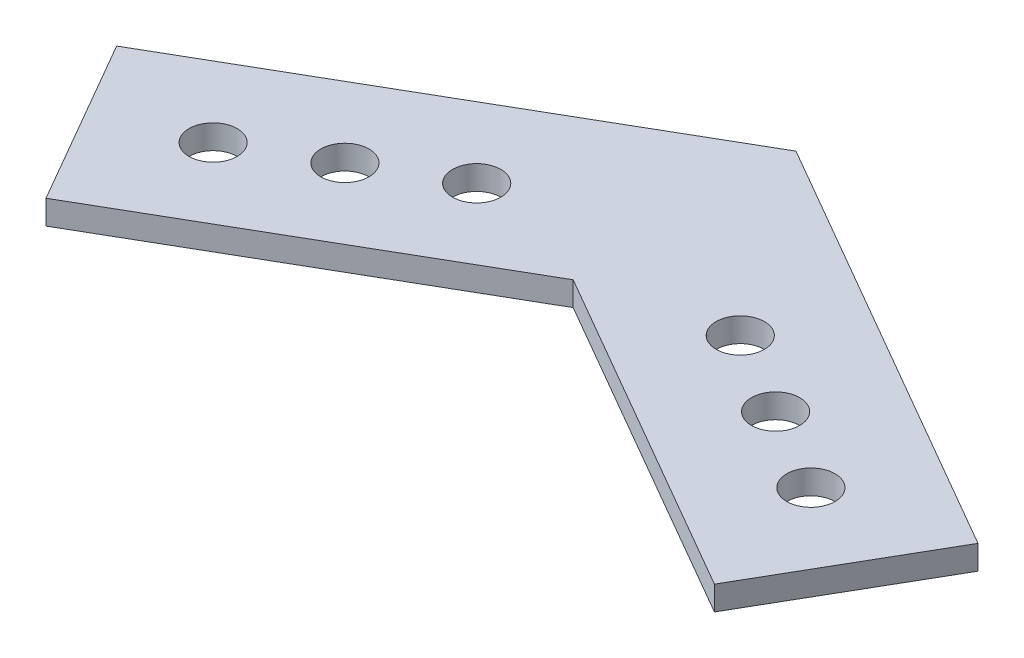
ISO-10303-21;
HEADER;
FILE_DESCRIPTION(('STEP AP214'),'2;1');
FILE_NAME('part.step','',(''),(''),'','','');
FILE_SCHEMA(('AUTOMOTIVE_DESIGN { 1 0 10303 214 1 1 1 1 }'));
ENDSEC;
DATA;
#1=APPLICATION_CONTEXT('core data for automotive mechanical design processes');
#2=APPLICATION_PROTOCOL_DEFINITION('international standard','automotive_design',2000,#1);
#3=PRODUCT_CONTEXT('',#1,'mechanical');
#4=PRODUCT('Part','Part','',(#3));
#5=PRODUCT_RELATED_PRODUCT_CATEGORY('part','',(#4));
#6=PRODUCT_DEFINITION_FORMATION('','',#4);
#7=PRODUCT_DEFINITION_CONTEXT('part definition',#1,'design');
#8=PRODUCT_DEFINITION('design','',#6,#7);
#9=PRODUCT_DEFINITION_SHAPE('','',#8);
#10=(LENGTH_UNIT() NAMED_UNIT(*) SI_UNIT(.MILLI.,.METRE.));
#11=(NAMED_UNIT(*) PLANE_ANGLE_UNIT() SI_UNIT($,.RADIAN.));
#12=(NAMED_UNIT(*) SI_UNIT($,.STERADIAN.) SOLID_ANGLE_UNIT());
#13=UNCERTAINTY_MEASURE_WITH_UNIT(LENGTH_MEASURE(1.E-05),#10,'distance_accuracy_value','');
#14=(GEOMETRIC_REPRESENTATION_CONTEXT(3) GLOBAL_UNCERTAINTY_ASSIGNED_CONTEXT((#13)) GLOBAL_UNIT_ASSIGNED_CONTEXT((#10,
#11,#12)) REPRESENTATION_CONTEXT('',''));
#15=CARTESIAN_POINT('',(0.,0.,0.));
#16=DIRECTION('',(0.,0.,1.));
#17=DIRECTION('',(1.,0.,0.));
#18=AXIS2_PLACEMENT_3D('',#15,#16,#17);
#19=CARTESIAN_POINT('',(-43.9940905122494,3.175,25.4000000000001));
#20=DIRECTION('',(-0.866025403784438,0.,0.500000000000001));
#21=DIRECTION('',(0.500000000000001,0.,0.866025403784438));
#22=AXIS2_PLACEMENT_3D('',#19,#20,#21);
#23=PLANE('',#22);
#24=DIRECTION('',(-0.500000000000001,0.,-0.866025403784438));
#25=VECTOR('',#24,1.);
#26=CARTESIAN_POINT('',(-43.9940905122494,0.,25.4000000000001));
#27=LINE('',#26,#25);
#28=CARTESIAN_POINT('',(-43.9940905122494,0.,25.4000000000001));
#29=VERTEX_POINT('',#28);
#30=CARTESIAN_POINT('',(-56.6940905122495,0.,3.40295474387533));
#31=VERTEX_POINT('',#30);
#32=EDGE_CURVE('E136',#29,#31,#27,.T.);
#33=ORIENTED_EDGE('',*,*,#32,.F.);
#34=DIRECTION('',(0.,-1.,0.));
#35=VECTOR('',#34,1.);
#36=CARTESIAN_POINT('',(-43.9940905122494,3.175,25.4000000000001));
#37=LINE('',#36,#35);
#38=CARTESIAN_POINT('',(-43.9940905122494,3.175,25.4000000000001));
#39=VERTEX_POINT('',#38);
#40=EDGE_CURVE('E53',#39,#29,#37,.T.);
#41=ORIENTED_EDGE('',*,*,#40,.F.);
#42=DIRECTION('',(-0.500000000000001,0.,-0.866025403784438));
#43=VECTOR('',#42,1.);
#44=CARTESIAN_POINT('',(-43.9940905122494,3.175,25.4000000000001));
#45=LINE('',#44,#43);
#46=CARTESIAN_POINT('',(-56.6940905122495,3.175,3.40295474387533));
#47=VERTEX_POINT('',#46);
#48=EDGE_CURVE('E130',#39,#47,#45,.T.);
#49=ORIENTED_EDGE('',*,*,#48,.T.);
#50=DIRECTION('',(0.,-1.,0.));
#51=VECTOR('',#50,1.);
#52=CARTESIAN_POINT('',(-56.6940905122495,3.175,3.40295474387533));
#53=LINE('',#52,#51);
#54=EDGE_CURVE('E11',#47,#31,#53,.T.);
#55=ORIENTED_EDGE('',*,*,#54,.T.);
#56=EDGE_LOOP('',(#33,#41,#49,#55));
#57=FACE_BOUND('',#56,.T.);
#58=ADVANCED_FACE('F44',(#57),#23,.T.);
#59=CARTESIAN_POINT('',(0.,3.175,0.));
#60=DIRECTION('',(0.500000000000001,0.,0.866025403784438));
#61=DIRECTION('',(0.866025403784438,0.,-0.500000000000001));
#62=AXIS2_PLACEMENT_3D('',#59,#60,#61);
#63=PLANE('',#62);
#64=DIRECTION('',(-0.866025403784438,0.,0.500000000000001));
#65=VECTOR('',#64,1.);
#66=CARTESIAN_POINT('',(0.,0.,0.));
#67=LINE('',#66,#65);
#68=CARTESIAN_POINT('',(0.,0.,0.));
#69=VERTEX_POINT('',#68);
#70=EDGE_CURVE('E140',#69,#29,#67,.T.);
#71=ORIENTED_EDGE('',*,*,#70,.F.);
#72=DIRECTION('',(0.,-1.,0.));
#73=VECTOR('',#72,1.);
#74=CARTESIAN_POINT('',(0.,3.175,0.));
#75=LINE('',#74,#73);
#76=CARTESIAN_POINT('',(0.,3.175,0.));
#77=VERTEX_POINT('',#76);
#78=EDGE_CURVE('E114',#77,#69,#75,.T.);
#79=ORIENTED_EDGE('',*,*,#78,.F.);
#80=DIRECTION('',(-0.866025403784438,0.,0.500000000000001));
#81=VECTOR('',#80,1.);
#82=CARTESIAN_POINT('',(0.,3.175,0.));
#83=LINE('',#82,#81);
#84=EDGE_CURVE('E126',#77,#39,#83,.T.);
#85=ORIENTED_EDGE('',*,*,#84,.T.);
#86=ORIENTED_EDGE('',*,*,#40,.T.);
#87=EDGE_LOOP('',(#71,#79,#85,#86));
#88=FACE_BOUND('',#87,.T.);
#89=ADVANCED_FACE('F164',(#88),#63,.T.);
#90=CARTESIAN_POINT('',(43.9940905122494,3.175,25.4));
#91=DIRECTION('',(-0.500000000000001,0.,0.866025403784438));
#92=DIRECTION('',(0.866025403784438,0.,0.500000000000001));
#93=AXIS2_PLACEMENT_3D('',#90,#91,#92);
#94=PLANE('',#93);
#95=DIRECTION('',(-0.866025403784438,0.,-0.500000000000001));
#96=VECTOR('',#95,1.);
#97=CARTESIAN_POINT('',(43.9940905122494,0.,25.4));
#98=LINE('',#97,#96);
#99=CARTESIAN_POINT('',(43.9940905122494,0.,25.4));
#100=VERTEX_POINT('',#99);
#101=EDGE_CURVE('E111',#100,#69,#98,.T.);
#102=ORIENTED_EDGE('',*,*,#101,.F.);
#103=DIRECTION('',(0.,-1.,0.));
#104=VECTOR('',#103,1.);
#105=CARTESIAN_POINT('',(43.9940905122494,3.175,25.4));
#106=LINE('',#105,#104);
#107=CARTESIAN_POINT('',(43.9940905122494,3.175,25.4));
#108=VERTEX_POINT('',#107);
#109=EDGE_CURVE('E105',#108,#100,#106,.T.);
#110=ORIENTED_EDGE('',*,*,#109,.F.);
#111=DIRECTION('',(-0.866025403784438,0.,-0.500000000000001));
#112=VECTOR('',#111,1.);
#113=CARTESIAN_POINT('',(43.9940905122494,3.175,25.4));
#114=LINE('',#113,#112);
#115=EDGE_CURVE('E109',#108,#77,#114,.T.);
#116=ORIENTED_EDGE('',*,*,#115,.T.);
#117=ORIENTED_EDGE('',*,*,#78,.T.);
#118=EDGE_LOOP('',(#102,#110,#116,#117));
#119=FACE_BOUND('',#118,.T.);
#120=ADVANCED_FACE('F107',(#119),#94,.T.);
#121=CARTESIAN_POINT('',(43.9940905122494,3.175,25.4));
#122=DIRECTION('',(-0.866025403784437,0.,-0.500000000000002));
#123=DIRECTION('',(-0.500000000000002,0.,0.866025403784437));
#124=AXIS2_PLACEMENT_3D('',#121,#122,#123);
#125=PLANE('',#124);
#126=DIRECTION('',(0.500000000000002,0.,-0.866025403784437));
#127=VECTOR('',#126,1.);
#128=CARTESIAN_POINT('',(43.9940905122494,0.,25.4));
#129=LINE('',#128,#127);
#130=CARTESIAN_POINT('',(56.6940905122495,0.,3.4029547438753));
#131=VERTEX_POINT('',#130);
#132=EDGE_CURVE('E147',#100,#131,#129,.T.);
#133=ORIENTED_EDGE('',*,*,#132,.T.);
#134=DIRECTION('',(0.,-1.,0.));
#135=VECTOR('',#134,1.);
#136=CARTESIAN_POINT('',(56.6940905122495,3.175,3.4029547438753));
#137=LINE('',#136,#135);
#138=CARTESIAN_POINT('',(56.6940905122495,3.175,3.4029547438753));
#139=VERTEX_POINT('',#138);
#140=EDGE_CURVE('E115',#139,#131,#137,.T.);
#141=ORIENTED_EDGE('',*,*,#140,.F.);
#142=DIRECTION('',(0.500000000000002,0.,-0.866025403784437));
#143=VECTOR('',#142,1.);
#144=CARTESIAN_POINT('',(43.9940905122494,3.175,25.4));
#145=LINE('',#144,#143);
#146=EDGE_CURVE('E118',#108,#139,#145,.T.);
#147=ORIENTED_EDGE('',*,*,#146,.F.);
#148=ORIENTED_EDGE('',*,*,#109,.T.);
#149=EDGE_LOOP('',(#133,#141,#147,#148));
#150=FACE_BOUND('',#149,.T.);
#151=ADVANCED_FACE('F119',(#150),#125,.F.);
#152=CARTESIAN_POINT('',(0.,3.175,-29.329393674833));
#153=DIRECTION('',(0.500000000000001,0.,-0.866025403784438));
#154=DIRECTION('',(-0.866025403784438,0.,-0.500000000000001));
#155=AXIS2_PLACEMENT_3D('',#152,#153,#154);
#156=PLANE('',#155);
#157=DIRECTION('',(0.866025403784438,0.,0.500000000000001));
#158=VECTOR('',#157,1.);
#159=CARTESIAN_POINT('',(0.,0.,-29.329393674833));
#160=LINE('',#159,#158);
#161=CARTESIAN_POINT('',(0.,0.,-29.329393674833));
#162=VERTEX_POINT('',#161);
#163=EDGE_CURVE('E84',#162,#131,#160,.T.);
#164=ORIENTED_EDGE('',*,*,#163,.F.);
#165=DIRECTION('',(0.,-1.,0.));
#166=VECTOR('',#165,1.);
#167=CARTESIAN_POINT('',(0.,3.175,-29.329393674833));
#168=LINE('',#167,#166);
#169=CARTESIAN_POINT('',(0.,3.175,-29.329393674833));
#170=VERTEX_POINT('',#169);
#171=EDGE_CURVE('E90',#170,#162,#168,.T.);
#172=ORIENTED_EDGE('',*,*,#171,.F.);
#173=DIRECTION('',(-0.866025403784438,0.,-0.500000000000001));
#174=VECTOR('',#173,1.);
#175=CARTESIAN_POINT('',(56.6940905122495,3.175,3.4029547438753));
#176=LINE('',#175,#174);
#177=EDGE_CURVE('E61',#139,#170,#176,.T.);
#178=ORIENTED_EDGE('',*,*,#177,.F.);
#179=ORIENTED_EDGE('',*,*,#140,.T.);
#180=EDGE_LOOP('',(#164,#172,#178,#179));
#181=FACE_BOUND('',#180,.T.);
#182=ADVANCED_FACE('F169',(#181),#156,.T.);
#183=CARTESIAN_POINT('',(-25.3999999999999,3.175,-14.6646968374165));
#184=DIRECTION('',(-0.500000000000002,0.,-0.866025403784438));
#185=DIRECTION('',(-0.866025403784438,0.,0.500000000000002));
#186=AXIS2_PLACEMENT_3D('',#183,#184,#185);
#187=PLANE('',#186);
#188=DIRECTION('',(0.866025403784438,0.,-0.500000000000002));
#189=VECTOR('',#188,1.);
#190=CARTESIAN_POINT('',(-25.3999999999999,0.,-14.6646968374165));
#191=LINE('',#190,#189);
#192=EDGE_CURVE('E152',#31,#162,#191,.T.);
#193=ORIENTED_EDGE('',*,*,#192,.F.);
#194=ORIENTED_EDGE('',*,*,#54,.F.);
#195=DIRECTION('',(-0.866025403784438,0.,0.500000000000001));
#196=VECTOR('',#195,1.);
#197=CARTESIAN_POINT('',(-25.3999999999999,3.175,-14.6646968374165));
#198=LINE('',#197,#196);
#199=EDGE_CURVE('E94',#170,#47,#198,.T.);
#200=ORIENTED_EDGE('',*,*,#199,.F.);
#201=ORIENTED_EDGE('',*,*,#171,.T.);
#202=EDGE_LOOP('',(#193,#194,#200,#201));
#203=FACE_BOUND('',#202,.T.);
#204=ADVANCED_FACE('F170',(#203),#187,.T.);
#205=CARTESIAN_POINT('',(0.,3.175,0.));
#206=DIRECTION('',(0.,-1.,0.));
#207=DIRECTION('',(0.,0.,-1.));
#208=AXIS2_PLACEMENT_3D('',#205,#206,#207);
#209=PLANE('',#208);
#210=CARTESIAN_POINT('',(28.3470452561247,3.175,1.70147737193762));
#211=DIRECTION('',(0.,1.,0.));
#212=DIRECTION('',(0.,0.,1.));
#213=AXIS2_PLACEMENT_3D('',#210,#211,#212);
#214=CIRCLE('',#213,3.175);
#215=CARTESIAN_POINT('',(28.3470452561247,3.175,4.87647737193762));
#216=VERTEX_POINT('',#215);
#217=EDGE_CURVE('E215',#216,#216,#214,.T.);
#218=ORIENTED_EDGE('',*,*,#217,.F.);
#219=EDGE_LOOP('',(#218));
#220=FACE_BOUND('',#219,.T.);
#221=CARTESIAN_POINT('',(17.3485226280624,3.175,-4.64852262806239));
#222=DIRECTION('',(0.,1.,0.));
#223=DIRECTION('',(0.,0.,1.));
#224=AXIS2_PLACEMENT_3D('',#221,#222,#223);
#225=CIRCLE('',#224,3.175);
#226=CARTESIAN_POINT('',(17.3485226280624,3.175,-1.47352262806239));
#227=VERTEX_POINT('',#226);
#228=EDGE_CURVE('E207',#227,#227,#225,.T.);
#229=ORIENTED_EDGE('',*,*,#228,.F.);
#230=EDGE_LOOP('',(#229));
#231=FACE_BOUND('',#230,.T.);
#232=CARTESIAN_POINT('',(39.3455678841871,3.175,8.05147737193763));
#233=DIRECTION('',(0.,1.,0.));
#234=DIRECTION('',(0.,0.,1.));
#235=AXIS2_PLACEMENT_3D('',#232,#233,#234);
#236=CIRCLE('',#235,3.175);
#237=CARTESIAN_POINT('',(39.3455678841871,3.175,11.2264773719376));
#238=VERTEX_POINT('',#237);
#239=EDGE_CURVE('E199',#238,#238,#236,.T.);
#240=ORIENTED_EDGE('',*,*,#239,.F.);
#241=EDGE_LOOP('',(#240));
#242=FACE_BOUND('',#241,.T.);
#243=CARTESIAN_POINT('',(-28.3470452561247,3.175,1.70147737193766));
#244=DIRECTION('',(0.,1.,0.));
#245=DIRECTION('',(0.,0.,1.));
#246=AXIS2_PLACEMENT_3D('',#243,#244,#245);
#247=CIRCLE('',#246,3.175);
#248=CARTESIAN_POINT('',(-28.3470452561247,3.175,4.87647737193766));
#249=VERTEX_POINT('',#248);
#250=EDGE_CURVE('E192',#249,#249,#247,.T.);
#251=ORIENTED_EDGE('',*,*,#250,.F.);
#252=EDGE_LOOP('',(#251));
#253=FACE_BOUND('',#252,.T.);
#254=CARTESIAN_POINT('',(-17.3485226280624,3.175,-4.64852262806235));
#255=DIRECTION('',(0.,1.,0.));
#256=DIRECTION('',(0.,0.,1.));
#257=AXIS2_PLACEMENT_3D('',#254,#255,#256);
#258=CIRCLE('',#257,3.175);
#259=CARTESIAN_POINT('',(-17.3485226280624,3.175,-1.47352262806235));
#260=VERTEX_POINT('',#259);
#261=EDGE_CURVE('E183',#260,#260,#258,.T.);
#262=ORIENTED_EDGE('',*,*,#261,.F.);
#263=EDGE_LOOP('',(#262));
#264=FACE_BOUND('',#263,.T.);
#265=CARTESIAN_POINT('',(-39.3455678841871,3.175,8.05147737193768));
#266=DIRECTION('',(0.,1.,0.));
#267=DIRECTION('',(0.,0.,1.));
#268=AXIS2_PLACEMENT_3D('',#265,#266,#267);
#269=CIRCLE('',#268,3.175);
#270=CARTESIAN_POINT('',(-39.3455678841871,3.175,11.2264773719377));
#271=VERTEX_POINT('',#270);
#272=EDGE_CURVE('E175',#271,#271,#269,.T.);
#273=ORIENTED_EDGE('',*,*,#272,.F.);
#274=EDGE_LOOP('',(#273));
#275=FACE_BOUND('',#274,.T.);
#276=ORIENTED_EDGE('',*,*,#199,.T.);
#277=ORIENTED_EDGE('',*,*,#48,.F.);
#278=ORIENTED_EDGE('',*,*,#84,.F.);
#279=ORIENTED_EDGE('',*,*,#115,.F.);
#280=ORIENTED_EDGE('',*,*,#146,.T.);
#281=ORIENTED_EDGE('',*,*,#177,.T.);
#282=EDGE_LOOP('',(#276,#277,#278,#279,#280,#281));
#283=FACE_BOUND('',#282,.T.);
#284=ADVANCED_FACE('F124',(#220,#231,#242,#253,#264,#275,#283),#209,.F.);
#285=CARTESIAN_POINT('',(0.,0.,0.));
#286=DIRECTION('',(0.,-1.,0.));
#287=DIRECTION('',(0.,0.,-1.));
#288=AXIS2_PLACEMENT_3D('',#285,#286,#287);
#289=PLANE('',#288);
#290=CARTESIAN_POINT('',(28.3470452561247,0.,1.70147737193762));
#291=DIRECTION('',(0.,1.,0.));
#292=DIRECTION('',(0.,0.,1.));
#293=AXIS2_PLACEMENT_3D('',#290,#291,#292);
#294=CIRCLE('',#293,3.175);
#295=CARTESIAN_POINT('',(28.3470452561247,0.,4.87647737193762));
#296=VERTEX_POINT('',#295);
#297=EDGE_CURVE('E203',#296,#296,#294,.T.);
#298=ORIENTED_EDGE('',*,*,#297,.T.);
#299=EDGE_LOOP('',(#298));
#300=FACE_BOUND('',#299,.T.);
#301=CARTESIAN_POINT('',(17.3485226280624,0.,-4.64852262806239));
#302=DIRECTION('',(0.,1.,0.));
#303=DIRECTION('',(0.,0.,1.));
#304=AXIS2_PLACEMENT_3D('',#301,#302,#303);
#305=CIRCLE('',#304,3.175);
#306=CARTESIAN_POINT('',(17.3485226280624,0.,-1.47352262806239));
#307=VERTEX_POINT('',#306);
#308=EDGE_CURVE('E211',#307,#307,#305,.T.);
#309=ORIENTED_EDGE('',*,*,#308,.T.);
#310=EDGE_LOOP('',(#309));
#311=FACE_BOUND('',#310,.T.);
#312=CARTESIAN_POINT('',(39.3455678841871,0.,8.05147737193763));
#313=DIRECTION('',(0.,1.,0.));
#314=DIRECTION('',(0.,0.,1.));
#315=AXIS2_PLACEMENT_3D('',#312,#313,#314);
#316=CIRCLE('',#315,3.175);
#317=CARTESIAN_POINT('',(39.3455678841871,0.,11.2264773719376));
#318=VERTEX_POINT('',#317);
#319=EDGE_CURVE('E188',#318,#318,#316,.T.);
#320=ORIENTED_EDGE('',*,*,#319,.T.);
#321=EDGE_LOOP('',(#320));
#322=FACE_BOUND('',#321,.T.);
#323=CARTESIAN_POINT('',(-28.3470452561247,0.,1.70147737193766));
#324=DIRECTION('',(0.,1.,0.));
#325=DIRECTION('',(0.,0.,1.));
#326=AXIS2_PLACEMENT_3D('',#323,#324,#325);
#327=CIRCLE('',#326,3.175);
#328=CARTESIAN_POINT('',(-28.3470452561247,0.,4.87647737193766));
#329=VERTEX_POINT('',#328);
#330=EDGE_CURVE('E179',#329,#329,#327,.T.);
#331=ORIENTED_EDGE('',*,*,#330,.T.);
#332=EDGE_LOOP('',(#331));
#333=FACE_BOUND('',#332,.T.);
#334=CARTESIAN_POINT('',(-17.3485226280624,0.,-4.64852262806235));
#335=DIRECTION('',(0.,1.,0.));
#336=DIRECTION('',(0.,0.,1.));
#337=AXIS2_PLACEMENT_3D('',#334,#335,#336);
#338=CIRCLE('',#337,3.175);
#339=CARTESIAN_POINT('',(-17.3485226280624,0.,-1.47352262806235));
#340=VERTEX_POINT('',#339);
#341=EDGE_CURVE('E187',#340,#340,#338,.T.);
#342=ORIENTED_EDGE('',*,*,#341,.T.);
#343=EDGE_LOOP('',(#342));
#344=FACE_BOUND('',#343,.T.);
#345=CARTESIAN_POINT('',(-39.3455678841871,0.,8.05147737193768));
#346=DIRECTION('',(0.,1.,0.));
#347=DIRECTION('',(0.,0.,1.));
#348=AXIS2_PLACEMENT_3D('',#345,#346,#347);
#349=CIRCLE('',#348,3.175);
#350=CARTESIAN_POINT('',(-39.3455678841871,0.,11.2264773719377));
#351=VERTEX_POINT('',#350);
#352=EDGE_CURVE('E141',#351,#351,#349,.T.);
#353=ORIENTED_EDGE('',*,*,#352,.T.);
#354=EDGE_LOOP('',(#353));
#355=FACE_BOUND('',#354,.T.);
#356=ORIENTED_EDGE('',*,*,#32,.T.);
#357=ORIENTED_EDGE('',*,*,#192,.T.);
#358=ORIENTED_EDGE('',*,*,#163,.T.);
#359=ORIENTED_EDGE('',*,*,#132,.F.);
#360=ORIENTED_EDGE('',*,*,#101,.T.);
#361=ORIENTED_EDGE('',*,*,#70,.T.);
#362=EDGE_LOOP('',(#356,#357,#358,#359,#360,#361));
#363=FACE_BOUND('',#362,.T.);
#364=ADVANCED_FACE('F167',(#300,#311,#322,#333,#344,#355,#363),#289,.T.);
#365=CARTESIAN_POINT('',(-39.3455678841871,0.,8.05147737193768));
#366=DIRECTION('',(0.,1.,0.));
#367=DIRECTION('',(0.,0.,1.));
#368=AXIS2_PLACEMENT_3D('',#365,#366,#367);
#369=CYLINDRICAL_SURFACE('',#368,3.175);
#370=ORIENTED_EDGE('',*,*,#352,.F.);
#371=EDGE_LOOP('',(#370));
#372=FACE_BOUND('',#371,.T.);
#373=ORIENTED_EDGE('',*,*,#272,.T.);
#374=EDGE_LOOP('',(#373));
#375=FACE_BOUND('',#374,.T.);
#376=ADVANCED_FACE('F245',(#372,#375),#369,.F.);
#377=CARTESIAN_POINT('',(-17.3485226280624,0.,-4.64852262806235));
#378=DIRECTION('',(0.,1.,0.));
#379=DIRECTION('',(0.,0.,1.));
#380=AXIS2_PLACEMENT_3D('',#377,#378,#379);
#381=CYLINDRICAL_SURFACE('',#380,3.175);
#382=ORIENTED_EDGE('',*,*,#341,.F.);
#383=EDGE_LOOP('',(#382));
#384=FACE_BOUND('',#383,.T.);
#385=ORIENTED_EDGE('',*,*,#261,.T.);
#386=EDGE_LOOP('',(#385));
#387=FACE_BOUND('',#386,.T.);
#388=ADVANCED_FACE('F247',(#384,#387),#381,.F.);
#389=CARTESIAN_POINT('',(-28.3470452561247,0.,1.70147737193766));
#390=DIRECTION('',(0.,1.,0.));
#391=DIRECTION('',(0.,0.,1.));
#392=AXIS2_PLACEMENT_3D('',#389,#390,#391);
#393=CYLINDRICAL_SURFACE('',#392,3.175);
#394=ORIENTED_EDGE('',*,*,#330,.F.);
#395=EDGE_LOOP('',(#394));
#396=FACE_BOUND('',#395,.T.);
#397=ORIENTED_EDGE('',*,*,#250,.T.);
#398=EDGE_LOOP('',(#397));
#399=FACE_BOUND('',#398,.T.);
#400=ADVANCED_FACE('F254',(#396,#399),#393,.F.);
#401=CARTESIAN_POINT('',(39.3455678841871,0.,8.05147737193763));
#402=DIRECTION('',(0.,1.,0.));
#403=DIRECTION('',(0.,0.,1.));
#404=AXIS2_PLACEMENT_3D('',#401,#402,#403);
#405=CYLINDRICAL_SURFACE('',#404,3.175);
#406=ORIENTED_EDGE('',*,*,#319,.F.);
#407=EDGE_LOOP('',(#406));
#408=FACE_BOUND('',#407,.T.);
#409=ORIENTED_EDGE('',*,*,#239,.T.);
#410=EDGE_LOOP('',(#409));
#411=FACE_BOUND('',#410,.T.);
#412=ADVANCED_FACE('F298',(#408,#411),#405,.F.);
#413=CARTESIAN_POINT('',(17.3485226280624,0.,-4.64852262806239));
#414=DIRECTION('',(0.,1.,0.));
#415=DIRECTION('',(0.,0.,1.));
#416=AXIS2_PLACEMENT_3D('',#413,#414,#415);
#417=CYLINDRICAL_SURFACE('',#416,3.175);
#418=ORIENTED_EDGE('',*,*,#308,.F.);
#419=EDGE_LOOP('',(#418));
#420=FACE_BOUND('',#419,.T.);
#421=ORIENTED_EDGE('',*,*,#228,.T.);
#422=EDGE_LOOP('',(#421));
#423=FACE_BOUND('',#422,.T.);
#424=ADVANCED_FACE('F228',(#420,#423),#417,.F.);
#425=CARTESIAN_POINT('',(28.3470452561247,0.,1.70147737193762));
#426=DIRECTION('',(0.,1.,0.));
#427=DIRECTION('',(0.,0.,1.));
#428=AXIS2_PLACEMENT_3D('',#425,#426,#427);
#429=CYLINDRICAL_SURFACE('',#428,3.175);
#430=ORIENTED_EDGE('',*,*,#297,.F.);
#431=EDGE_LOOP('',(#430));
#432=FACE_BOUND('',#431,.T.);
#433=ORIENTED_EDGE('',*,*,#217,.T.);
#434=EDGE_LOOP('',(#433));
#435=FACE_BOUND('',#434,.T.);
#436=ADVANCED_FACE('F225',(#432,#435),#429,.F.);
#437=CLOSED_SHELL('',(#58,#89,#120,#151,#182,#204,#284,#364,#376,#388,#400,#412,#424,#436));
#438=MANIFOLD_SOLID_BREP('B2',#437);
#439=ADVANCED_BREP_SHAPE_REPRESENTATION('',(#18,#438),#14);
#440=SHAPE_DEFINITION_REPRESENTATION(#9,#439);
ENDSEC;
END-ISO-10303-21;
